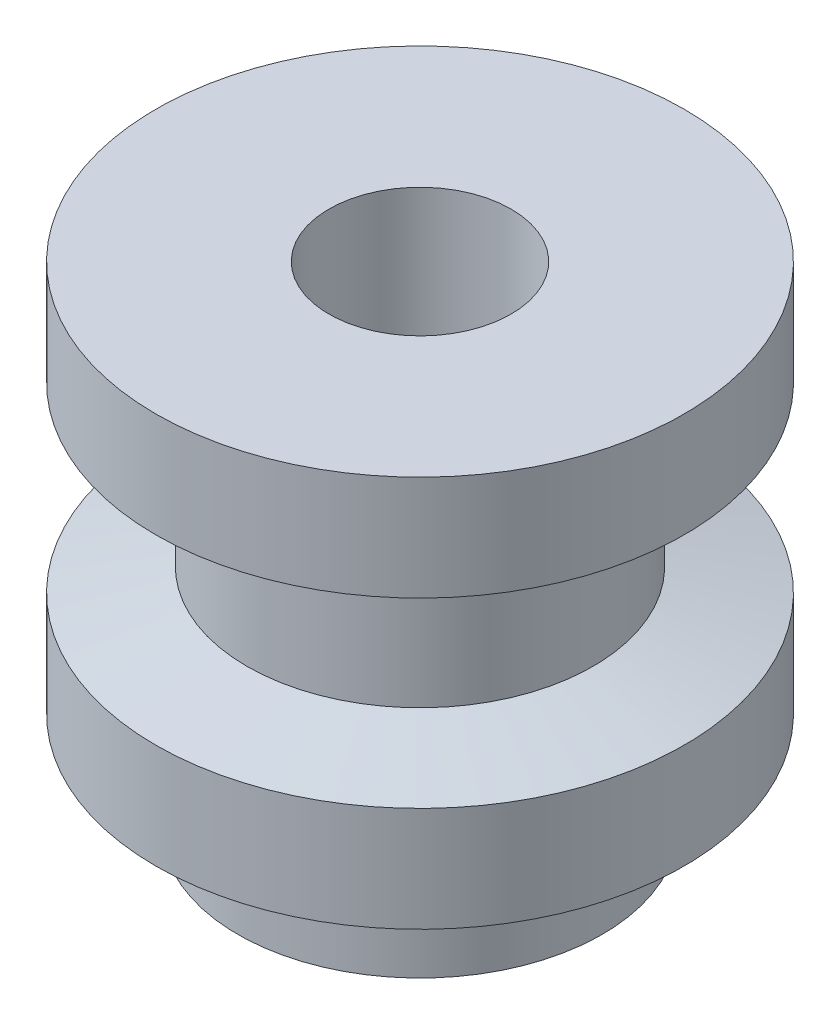
ISO-10303-21;
HEADER;
FILE_DESCRIPTION(('STEP AP214'),'2;1');
FILE_NAME('part.step','',(''),(''),'','','');
FILE_SCHEMA(('AUTOMOTIVE_DESIGN { 1 0 10303 214 1 1 1 1 }'));
ENDSEC;
DATA;
#1=APPLICATION_CONTEXT('core data for automotive mechanical design processes');
#2=APPLICATION_PROTOCOL_DEFINITION('international standard','automotive_design',2000,#1);
#3=PRODUCT_CONTEXT('',#1,'mechanical');
#4=PRODUCT('Part','Part','',(#3));
#5=PRODUCT_RELATED_PRODUCT_CATEGORY('part','',(#4));
#6=PRODUCT_DEFINITION_FORMATION('','',#4);
#7=PRODUCT_DEFINITION_CONTEXT('part definition',#1,'design');
#8=PRODUCT_DEFINITION('design','',#6,#7);
#9=PRODUCT_DEFINITION_SHAPE('','',#8);
#10=(LENGTH_UNIT() NAMED_UNIT(*) SI_UNIT(.MILLI.,.METRE.));
#11=(NAMED_UNIT(*) PLANE_ANGLE_UNIT() SI_UNIT($,.RADIAN.));
#12=(NAMED_UNIT(*) SI_UNIT($,.STERADIAN.) SOLID_ANGLE_UNIT());
#13=UNCERTAINTY_MEASURE_WITH_UNIT(LENGTH_MEASURE(1.E-05),#10,'distance_accuracy_value','');
#14=(GEOMETRIC_REPRESENTATION_CONTEXT(3) GLOBAL_UNCERTAINTY_ASSIGNED_CONTEXT((#13)) GLOBAL_UNIT_ASSIGNED_CONTEXT((#10,
#11,#12)) REPRESENTATION_CONTEXT('',''));
#15=CARTESIAN_POINT('',(0.,0.,0.));
#16=DIRECTION('',(0.,0.,1.));
#17=DIRECTION('',(1.,0.,0.));
#18=AXIS2_PLACEMENT_3D('',#15,#16,#17);
#19=CARTESIAN_POINT('',(0.,0.,2.));
#20=DIRECTION('',(0.,1.,0.));
#21=DIRECTION('',(0.,0.,1.));
#22=AXIS2_PLACEMENT_3D('',#19,#20,#21);
#23=PLANE('',#22);
#24=CARTESIAN_POINT('',(0.,0.,0.));
#25=DIRECTION('',(0.,-1.,0.));
#26=DIRECTION('',(0.,0.,-1.));
#27=AXIS2_PLACEMENT_3D('',#24,#25,#26);
#28=CIRCLE('',#27,1.);
#29=CARTESIAN_POINT('',(0.,0.,-1.));
#30=VERTEX_POINT('',#29);
#31=EDGE_CURVE('E10',#30,#30,#28,.T.);
#32=ORIENTED_EDGE('',*,*,#31,.F.);
#33=EDGE_LOOP('',(#32));
#34=FACE_BOUND('',#33,.T.);
#35=CARTESIAN_POINT('',(0.,0.,0.));
#36=DIRECTION('',(0.,-1.,0.));
#37=DIRECTION('',(0.,0.,-1.));
#38=AXIS2_PLACEMENT_3D('',#35,#36,#37);
#39=CIRCLE('',#38,2.);
#40=CARTESIAN_POINT('',(0.,0.,-2.));
#41=VERTEX_POINT('',#40);
#42=EDGE_CURVE('E64',#41,#41,#39,.T.);
#43=ORIENTED_EDGE('',*,*,#42,.T.);
#44=EDGE_LOOP('',(#43));
#45=FACE_BOUND('',#44,.T.);
#46=ADVANCED_FACE('F30',(#34,#45),#23,.F.);
#47=CARTESIAN_POINT('',(0.,0.,0.));
#48=DIRECTION('',(0.,-1.,0.));
#49=DIRECTION('',(0.,0.,-1.));
#50=AXIS2_PLACEMENT_3D('',#47,#48,#49);
#51=CYLINDRICAL_SURFACE('',#50,1.);
#52=CARTESIAN_POINT('',(0.,5.4,0.));
#53=DIRECTION('',(0.,-1.,0.));
#54=DIRECTION('',(0.,0.,-1.));
#55=AXIS2_PLACEMENT_3D('',#52,#53,#54);
#56=CIRCLE('',#55,1.);
#57=CARTESIAN_POINT('',(0.,5.4,-1.));
#58=VERTEX_POINT('',#57);
#59=EDGE_CURVE('E36',#58,#58,#56,.T.);
#60=ORIENTED_EDGE('',*,*,#59,.F.);
#61=EDGE_LOOP('',(#60));
#62=FACE_BOUND('',#61,.T.);
#63=ORIENTED_EDGE('',*,*,#31,.T.);
#64=EDGE_LOOP('',(#63));
#65=FACE_BOUND('',#64,.T.);
#66=ADVANCED_FACE('F113',(#62,#65),#51,.F.);
#67=CARTESIAN_POINT('',(0.,5.4,1.));
#68=DIRECTION('',(0.,-1.,0.));
#69=DIRECTION('',(0.,0.,-1.));
#70=AXIS2_PLACEMENT_3D('',#67,#68,#69);
#71=PLANE('',#70);
#72=CARTESIAN_POINT('',(0.,5.4,0.));
#73=DIRECTION('',(0.,-1.,0.));
#74=DIRECTION('',(0.,0.,-1.));
#75=AXIS2_PLACEMENT_3D('',#72,#73,#74);
#76=CIRCLE('',#75,2.9);
#77=CARTESIAN_POINT('',(0.,5.4,-2.9));
#78=VERTEX_POINT('',#77);
#79=EDGE_CURVE('E40',#78,#78,#76,.T.);
#80=ORIENTED_EDGE('',*,*,#79,.F.);
#81=EDGE_LOOP('',(#80));
#82=FACE_BOUND('',#81,.T.);
#83=ORIENTED_EDGE('',*,*,#59,.T.);
#84=EDGE_LOOP('',(#83));
#85=FACE_BOUND('',#84,.T.);
#86=ADVANCED_FACE('F108',(#82,#85),#71,.F.);
#87=CARTESIAN_POINT('',(0.,0.,0.));
#88=DIRECTION('',(0.,-1.,0.));
#89=DIRECTION('',(0.,0.,-1.));
#90=AXIS2_PLACEMENT_3D('',#87,#88,#89);
#91=CYLINDRICAL_SURFACE('',#90,2.9);
#92=CARTESIAN_POINT('',(0.,4.25,0.));
#93=DIRECTION('',(0.,-1.,0.));
#94=DIRECTION('',(0.,0.,-1.));
#95=AXIS2_PLACEMENT_3D('',#92,#93,#94);
#96=CIRCLE('',#95,2.9);
#97=CARTESIAN_POINT('',(0.,4.25,-2.9));
#98=VERTEX_POINT('',#97);
#99=EDGE_CURVE('E44',#98,#98,#96,.T.);
#100=ORIENTED_EDGE('',*,*,#99,.F.);
#101=EDGE_LOOP('',(#100));
#102=FACE_BOUND('',#101,.T.);
#103=ORIENTED_EDGE('',*,*,#79,.T.);
#104=EDGE_LOOP('',(#103));
#105=FACE_BOUND('',#104,.T.);
#106=ADVANCED_FACE('F102',(#102,#105),#91,.T.);
#107=CARTESIAN_POINT('',(0.,4.25,0.));
#108=DIRECTION('',(0.,1.,0.));
#109=DIRECTION('',(0.,0.,1.));
#110=AXIS2_PLACEMENT_3D('',#107,#108,#109);
#111=CONICAL_SURFACE('',#110,2.9,1.32581766366803);
#112=CARTESIAN_POINT('',(0.,4.,0.));
#113=DIRECTION('',(0.,-1.,0.));
#114=DIRECTION('',(0.,0.,-1.));
#115=AXIS2_PLACEMENT_3D('',#112,#113,#114);
#116=CIRCLE('',#115,1.9);
#117=CARTESIAN_POINT('',(0.,4.,-1.9));
#118=VERTEX_POINT('',#117);
#119=EDGE_CURVE('E49',#118,#118,#116,.T.);
#120=ORIENTED_EDGE('',*,*,#119,.F.);
#121=EDGE_LOOP('',(#120));
#122=FACE_BOUND('',#121,.T.);
#123=ORIENTED_EDGE('',*,*,#99,.T.);
#124=EDGE_LOOP('',(#123));
#125=FACE_BOUND('',#124,.T.);
#126=ADVANCED_FACE('F96',(#122,#125),#111,.T.);
#127=CARTESIAN_POINT('',(0.,0.,0.));
#128=DIRECTION('',(0.,-1.,0.));
#129=DIRECTION('',(0.,0.,-1.));
#130=AXIS2_PLACEMENT_3D('',#127,#128,#129);
#131=CYLINDRICAL_SURFACE('',#130,1.9);
#132=CARTESIAN_POINT('',(0.,2.5,0.));
#133=DIRECTION('',(0.,-1.,0.));
#134=DIRECTION('',(0.,0.,-1.));
#135=AXIS2_PLACEMENT_3D('',#132,#133,#134);
#136=CIRCLE('',#135,1.9);
#137=CARTESIAN_POINT('',(0.,2.5,-1.9));
#138=VERTEX_POINT('',#137);
#139=EDGE_CURVE('E52',#138,#138,#136,.T.);
#140=ORIENTED_EDGE('',*,*,#139,.F.);
#141=EDGE_LOOP('',(#140));
#142=FACE_BOUND('',#141,.T.);
#143=ORIENTED_EDGE('',*,*,#119,.T.);
#144=EDGE_LOOP('',(#143));
#145=FACE_BOUND('',#144,.T.);
#146=ADVANCED_FACE('F90',(#142,#145),#131,.T.);
#147=CARTESIAN_POINT('',(0.,2.5,0.));
#148=DIRECTION('',(0.,-1.,0.));
#149=DIRECTION('',(0.,0.,-1.));
#150=AXIS2_PLACEMENT_3D('',#147,#148,#149);
#151=CONICAL_SURFACE('',#150,1.9,1.32581766366803);
#152=CARTESIAN_POINT('',(0.,2.25,0.));
#153=DIRECTION('',(0.,-1.,0.));
#154=DIRECTION('',(0.,0.,-1.));
#155=AXIS2_PLACEMENT_3D('',#152,#153,#154);
#156=CIRCLE('',#155,2.9);
#157=CARTESIAN_POINT('',(0.,2.25,-2.9));
#158=VERTEX_POINT('',#157);
#159=EDGE_CURVE('E55',#158,#158,#156,.T.);
#160=ORIENTED_EDGE('',*,*,#159,.F.);
#161=EDGE_LOOP('',(#160));
#162=FACE_BOUND('',#161,.T.);
#163=ORIENTED_EDGE('',*,*,#139,.T.);
#164=EDGE_LOOP('',(#163));
#165=FACE_BOUND('',#164,.T.);
#166=ADVANCED_FACE('F84',(#162,#165),#151,.T.);
#167=CARTESIAN_POINT('',(0.,0.,0.));
#168=DIRECTION('',(0.,-1.,0.));
#169=DIRECTION('',(0.,0.,-1.));
#170=AXIS2_PLACEMENT_3D('',#167,#168,#169);
#171=CYLINDRICAL_SURFACE('',#170,2.9);
#172=CARTESIAN_POINT('',(0.,1.1,0.));
#173=DIRECTION('',(0.,-1.,0.));
#174=DIRECTION('',(0.,0.,-1.));
#175=AXIS2_PLACEMENT_3D('',#172,#173,#174);
#176=CIRCLE('',#175,2.9);
#177=CARTESIAN_POINT('',(0.,1.1,-2.9));
#178=VERTEX_POINT('',#177);
#179=EDGE_CURVE('E58',#178,#178,#176,.T.);
#180=ORIENTED_EDGE('',*,*,#179,.F.);
#181=EDGE_LOOP('',(#180));
#182=FACE_BOUND('',#181,.T.);
#183=ORIENTED_EDGE('',*,*,#159,.T.);
#184=EDGE_LOOP('',(#183));
#185=FACE_BOUND('',#184,.T.);
#186=ADVANCED_FACE('F78',(#182,#185),#171,.T.);
#187=CARTESIAN_POINT('',(0.,1.1,2.9));
#188=DIRECTION('',(0.,1.,0.));
#189=DIRECTION('',(0.,0.,1.));
#190=AXIS2_PLACEMENT_3D('',#187,#188,#189);
#191=PLANE('',#190);
#192=CARTESIAN_POINT('',(0.,1.1,0.));
#193=DIRECTION('',(0.,-1.,0.));
#194=DIRECTION('',(0.,0.,-1.));
#195=AXIS2_PLACEMENT_3D('',#192,#193,#194);
#196=CIRCLE('',#195,2.);
#197=CARTESIAN_POINT('',(0.,1.1,-2.));
#198=VERTEX_POINT('',#197);
#199=EDGE_CURVE('E61',#198,#198,#196,.T.);
#200=ORIENTED_EDGE('',*,*,#199,.F.);
#201=EDGE_LOOP('',(#200));
#202=FACE_BOUND('',#201,.T.);
#203=ORIENTED_EDGE('',*,*,#179,.T.);
#204=EDGE_LOOP('',(#203));
#205=FACE_BOUND('',#204,.T.);
#206=ADVANCED_FACE('F72',(#202,#205),#191,.F.);
#207=CARTESIAN_POINT('',(0.,0.,0.));
#208=DIRECTION('',(0.,-1.,0.));
#209=DIRECTION('',(0.,0.,-1.));
#210=AXIS2_PLACEMENT_3D('',#207,#208,#209);
#211=CYLINDRICAL_SURFACE('',#210,2.);
#212=ORIENTED_EDGE('',*,*,#42,.F.);
#213=EDGE_LOOP('',(#212));
#214=FACE_BOUND('',#213,.T.);
#215=ORIENTED_EDGE('',*,*,#199,.T.);
#216=EDGE_LOOP('',(#215));
#217=FACE_BOUND('',#216,.T.);
#218=ADVANCED_FACE('F69',(#214,#217),#211,.T.);
#219=CLOSED_SHELL('',(#46,#66,#86,#106,#126,#146,#166,#186,#206,#218));
#220=MANIFOLD_SOLID_BREP('B2',#219);
#221=ADVANCED_BREP_SHAPE_REPRESENTATION('',(#18,#220),#14);
#222=SHAPE_DEFINITION_REPRESENTATION(#9,#221);
ENDSEC;
END-ISO-10303-21;
